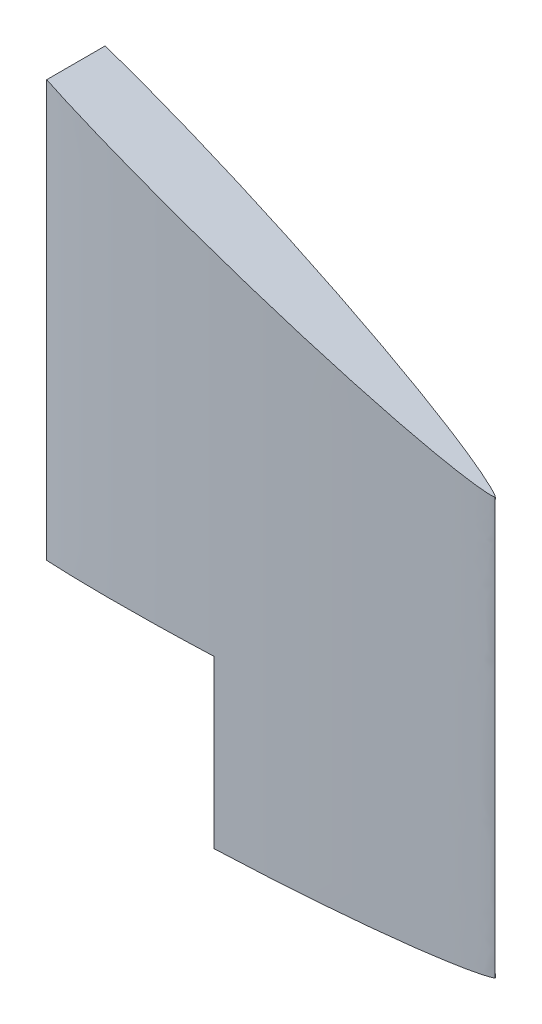
ISO-10303-21;
HEADER;
FILE_DESCRIPTION(('STEP AP214'),'2;1');
FILE_NAME('part.step','',(''),(''),'','','');
FILE_SCHEMA(('AUTOMOTIVE_DESIGN { 1 0 10303 214 1 1 1 1 }'));
ENDSEC;
DATA;
#1=APPLICATION_CONTEXT('core data for automotive mechanical design processes');
#2=APPLICATION_PROTOCOL_DEFINITION('international standard','automotive_design',2000,#1);
#3=PRODUCT_CONTEXT('',#1,'mechanical');
#4=PRODUCT('Part','Part','',(#3));
#5=PRODUCT_RELATED_PRODUCT_CATEGORY('part','',(#4));
#6=PRODUCT_DEFINITION_FORMATION('','',#4);
#7=PRODUCT_DEFINITION_CONTEXT('part definition',#1,'design');
#8=PRODUCT_DEFINITION('design','',#6,#7);
#9=PRODUCT_DEFINITION_SHAPE('','',#8);
#10=(LENGTH_UNIT() NAMED_UNIT(*) SI_UNIT(.MILLI.,.METRE.));
#11=(NAMED_UNIT(*) PLANE_ANGLE_UNIT() SI_UNIT($,.RADIAN.));
#12=(NAMED_UNIT(*) SI_UNIT($,.STERADIAN.) SOLID_ANGLE_UNIT());
#13=UNCERTAINTY_MEASURE_WITH_UNIT(LENGTH_MEASURE(1.E-05),#10,'distance_accuracy_value','');
#14=(GEOMETRIC_REPRESENTATION_CONTEXT(3) GLOBAL_UNCERTAINTY_ASSIGNED_CONTEXT((#13)) GLOBAL_UNIT_ASSIGNED_CONTEXT((#10,
#11,#12)) REPRESENTATION_CONTEXT('',''));
#15=CARTESIAN_POINT('',(0.,0.,0.));
#16=DIRECTION('',(0.,0.,1.));
#17=DIRECTION('',(1.,0.,0.));
#18=AXIS2_PLACEMENT_3D('',#15,#16,#17);
#19=CARTESIAN_POINT('',(4.,50.,0.));
#20=DIRECTION('',(-1.,0.,0.));
#21=DIRECTION('',(0.,0.,1.));
#22=AXIS2_PLACEMENT_3D('',#19,#20,#21);
#23=CYLINDRICAL_SURFACE('',#22,2.5);
#24=DIRECTION('',(-1.,0.,0.));
#25=VECTOR('',#24,1.);
#26=CARTESIAN_POINT('',(4.,50.,-2.5));
#27=LINE('',#26,#25);
#28=CARTESIAN_POINT('',(3.,50.,-2.5));
#29=VERTEX_POINT('',#28);
#30=CARTESIAN_POINT('',(0.,50.,-2.5));
#31=VERTEX_POINT('',#30);
#32=EDGE_CURVE('E327',#29,#31,#27,.T.);
#33=ORIENTED_EDGE('',*,*,#32,.F.);
#34=CARTESIAN_POINT('',(3.,50.,0.));
#35=DIRECTION('',(1.,0.,0.));
#36=DIRECTION('',(0.,0.,-1.));
#37=AXIS2_PLACEMENT_3D('',#34,#35,#36);
#38=CIRCLE('',#37,2.5);
#39=CARTESIAN_POINT('',(3.,50.,2.5));
#40=VERTEX_POINT('',#39);
#41=EDGE_CURVE('E11',#29,#40,#38,.T.);
#42=ORIENTED_EDGE('',*,*,#41,.T.);
#43=DIRECTION('',(-1.,0.,0.));
#44=VECTOR('',#43,1.);
#45=CARTESIAN_POINT('',(4.,50.,2.5));
#46=LINE('',#45,#44);
#47=CARTESIAN_POINT('',(0.,50.,2.5));
#48=VERTEX_POINT('',#47);
#49=EDGE_CURVE('E331',#48,#40,#46,.F.);
#50=ORIENTED_EDGE('',*,*,#49,.F.);
#51=CARTESIAN_POINT('',(0.,50.,0.));
#52=DIRECTION('',(1.,0.,0.));
#53=DIRECTION('',(0.,0.,-1.));
#54=AXIS2_PLACEMENT_3D('',#51,#52,#53);
#55=CIRCLE('',#54,2.5);
#56=EDGE_CURVE('E200',#31,#48,#55,.T.);
#57=ORIENTED_EDGE('',*,*,#56,.F.);
#58=EDGE_LOOP('',(#33,#42,#50,#57));
#59=FACE_BOUND('',#58,.T.);
#60=ADVANCED_FACE('F47',(#59),#23,.F.);
#61=CARTESIAN_POINT('',(20.,30.,100.));
#62=DIRECTION('',(0.,-1.,0.));
#63=DIRECTION('',(0.,0.,-1.));
#64=AXIS2_PLACEMENT_3D('',#61,#62,#63);
#65=PLANE('',#64);
#66=DIRECTION('',(0.,0.,-1.));
#67=VECTOR('',#66,1.);
#68=CARTESIAN_POINT('',(25.,30.,100.));
#69=LINE('',#68,#67);
#70=CARTESIAN_POINT('',(25.,30.,1.));
#71=VERTEX_POINT('',#70);
#72=CARTESIAN_POINT('',(25.,30.,-1.));
#73=VERTEX_POINT('',#72);
#74=EDGE_CURVE('E57',#71,#73,#69,.T.);
#75=ORIENTED_EDGE('',*,*,#74,.T.);
#76=DIRECTION('',(-1.,0.,0.));
#77=VECTOR('',#76,1.);
#78=CARTESIAN_POINT('',(20.,30.,-1.));
#79=LINE('',#78,#77);
#80=CARTESIAN_POINT('',(20.,30.,-1.));
#81=VERTEX_POINT('',#80);
#82=EDGE_CURVE('E197',#73,#81,#79,.T.);
#83=ORIENTED_EDGE('',*,*,#82,.T.);
#84=DIRECTION('',(0.,0.,-1.));
#85=VECTOR('',#84,1.);
#86=CARTESIAN_POINT('',(20.,30.,100.));
#87=LINE('',#86,#85);
#88=CARTESIAN_POINT('',(20.,30.,-3.43935953604389));
#89=VERTEX_POINT('',#88);
#90=EDGE_CURVE('E211',#81,#89,#87,.T.);
#91=ORIENTED_EDGE('',*,*,#90,.T.);
#92=CARTESIAN_POINT('',(50.3661592738637,30.,0.));
#93=CARTESIAN_POINT('',(50.3616118562395,30.,-0.00762680855709814));
#94=CARTESIAN_POINT('',(50.3512044792518,30.,-0.0200643696451995));
#95=CARTESIAN_POINT('',(50.3318826190291,30.,-0.0345900162266343));
#96=CARTESIAN_POINT('',(50.3035506437528,30.,-0.0542061046902817));
#97=CARTESIAN_POINT('',(50.2675502012029,30.,-0.0755566082807041));
#98=CARTESIAN_POINT('',(50.2125028650232,30.,-0.104975159955153));
#99=CARTESIAN_POINT('',(50.1196532979198,30.,-0.148566943095973));
#100=CARTESIAN_POINT('',(49.9578195191268,30.,-0.214752734128447));
#101=CARTESIAN_POINT('',(49.6652156749401,30.,-0.317523282541781));
#102=CARTESIAN_POINT('',(49.139251249857,30.,-0.473472151135026));
#103=CARTESIAN_POINT('',(48.2702240342564,30.,-0.688745907600272));
#104=CARTESIAN_POINT('',(46.7082308396749,30.,-1.01164002390838));
#105=CARTESIAN_POINT('',(44.5065746833417,30.,-1.38043235339458));
#106=CARTESIAN_POINT('',(41.7789466606536,30.,-1.75993168344461));
#107=CARTESIAN_POINT('',(38.6521261316823,30.,-2.12475953805125));
#108=CARTESIAN_POINT('',(35.5142655651926,30.,-2.43871046672291));
#109=CARTESIAN_POINT('',(32.3724356917928,30.,-2.71003640810005));
#110=CARTESIAN_POINT('',(29.2276790811344,30.,-2.9445648543411));
#111=CARTESIAN_POINT('',(26.0806013498758,30.,-3.14556526070059));
#112=CARTESIAN_POINT('',(22.931686571125,30.,-3.31520168505161));
#113=CARTESIAN_POINT('',(19.7812793383263,30.,-3.45435509452885));
#114=CARTESIAN_POINT('',(16.6296764172778,30.,-3.56326532612088));
#115=CARTESIAN_POINT('',(13.477153227085,30.,-3.64092262955651));
#116=CARTESIAN_POINT('',(10.3239677202417,30.,-3.6857079522972));
#117=CARTESIAN_POINT('',(7.170479651101,30.,-3.69356013589497));
#118=CARTESIAN_POINT('',(4.19455884170988,30.,-3.6608978186201));
#119=CARTESIAN_POINT('',(2.00769782103691,30.,-3.59990807983809));
#120=CARTESIAN_POINT('',(0.609689029807609,30.,-3.53853177419109));
#121=CARTESIAN_POINT('',(0.,30.,-3.5));
#122=B_SPLINE_CURVE_WITH_KNOTS('',4,(#92,#93,#94,#95,#96,#97,#98,#99,#100,#101,#102,#103,#104,
#105,#106,#107,#108,#109,#110,#111,#112,#113,#114,#115,#116,#117,#118,#119,#120,#121),
.UNSPECIFIED.,.F.,.F.,(5,1,1,1,1,1,1,1,1,1,1,1,1,1,1,1,1,1,1,1,1,1,1,1,1,1,5),(0.,
0.000698989607127983,0.00128797500242194,0.0018802402576548,0.00273339282005306,
0.00399607545305412,0.00621873732563578,0.00997421151381837,0.0165362239634812,
0.0284749684633255,0.0495243973178177,0.0806512334779741,0.142462146623907,0.204715828119719,
0.266969519588256,0.329223210986134,0.391476901103132,0.453730594074204,0.515984286439049,
0.578237976755758,0.640491668862722,0.702745360088075,0.76499905208171,0.82725274220259,
0.889506435243522,0.951760126967698,1.),.UNSPECIFIED.);
#123=CARTESIAN_POINT('',(50.3661592738637,30.,0.));
#124=VERTEX_POINT('',#123);
#125=EDGE_CURVE('E299',#89,#124,#122,.F.);
#126=ORIENTED_EDGE('',*,*,#125,.T.);
#127=CARTESIAN_POINT('',(0.,30.,3.5));
#128=CARTESIAN_POINT('',(0.609689029807609,30.,3.53853177419109));
#129=CARTESIAN_POINT('',(2.00769782103691,30.,3.59990807983809));
#130=CARTESIAN_POINT('',(4.19455884170988,30.,3.6608978186201));
#131=CARTESIAN_POINT('',(7.170479651101,30.,3.69356013589497));
#132=CARTESIAN_POINT('',(10.3239677202417,30.,3.6857079522972));
#133=CARTESIAN_POINT('',(13.477153227085,30.,3.64092262955651));
#134=CARTESIAN_POINT('',(16.6296764172778,30.,3.56326532612088));
#135=CARTESIAN_POINT('',(19.7812793383263,30.,3.45435509452885));
#136=CARTESIAN_POINT('',(22.931686571125,30.,3.31520168505161));
#137=CARTESIAN_POINT('',(26.0806013498758,30.,3.14556526070059));
#138=CARTESIAN_POINT('',(29.2276790811344,30.,2.9445648543411));
#139=CARTESIAN_POINT('',(32.3724356917928,30.,2.71003640810005));
#140=CARTESIAN_POINT('',(35.5142655651926,30.,2.43871046672291));
#141=CARTESIAN_POINT('',(38.6521261316823,30.,2.12475953805125));
#142=CARTESIAN_POINT('',(41.7789466606536,30.,1.75993168344461));
#143=CARTESIAN_POINT('',(44.5065746833417,30.,1.38043235339458));
#144=CARTESIAN_POINT('',(46.7082308396749,30.,1.01164002390838));
#145=CARTESIAN_POINT('',(48.2702240342564,30.,0.688745907600272));
#146=CARTESIAN_POINT('',(49.139251249857,30.,0.473472151135026));
#147=CARTESIAN_POINT('',(49.6652156749401,30.,0.317523282541781));
#148=CARTESIAN_POINT('',(49.9578195191268,30.,0.214752734128447));
#149=CARTESIAN_POINT('',(50.1196532979198,30.,0.148566943095973));
#150=CARTESIAN_POINT('',(50.2125028650232,30.,0.104975159955153));
#151=CARTESIAN_POINT('',(50.2675502012029,30.,0.0755566082807041));
#152=CARTESIAN_POINT('',(50.3035506437528,30.,0.0542061046902817));
#153=CARTESIAN_POINT('',(50.3318826190291,30.,0.0345900162266343));
#154=CARTESIAN_POINT('',(50.3512044792518,30.,0.0200643696451995));
#155=CARTESIAN_POINT('',(50.3616118562395,30.,0.00762680855709814));
#156=CARTESIAN_POINT('',(50.3661592738637,30.,0.));
#157=B_SPLINE_CURVE_WITH_KNOTS('',4,(#127,#128,#129,#130,#131,#132,#133,#134,#135,#136,#137,
#138,#139,#140,#141,#142,#143,#144,#145,#146,#147,#148,#149,#150,#151,#152,#153,#154,#155,#156),
.UNSPECIFIED.,.F.,.F.,(5,1,1,1,1,1,1,1,1,1,1,1,1,1,1,1,1,1,1,1,1,1,1,1,1,1,5),(0.,
0.0482398730323025,0.110493564756478,0.17274725779741,0.23500094791829,0.297254639911925,
0.359508331137278,0.421762023244242,0.484015713560951,0.546269405925796,0.608523098896868,
0.670776789013866,0.733030480411744,0.795284171880281,0.857537853376093,0.919348766522026,
0.950475602682182,0.971525031536674,0.983463776036519,0.990025788486182,0.993781262674364,
0.996003924546946,0.997266607179947,0.998119759742345,0.998712024997578,0.999301010392872,1.),.UNSPECIFIED.);
#158=CARTESIAN_POINT('',(20.,30.,3.43935953604389));
#159=VERTEX_POINT('',#158);
#160=EDGE_CURVE('E232',#124,#159,#157,.F.);
#161=ORIENTED_EDGE('',*,*,#160,.T.);
#162=CARTESIAN_POINT('',(20.,30.,1.));
#163=VERTEX_POINT('',#162);
#164=EDGE_CURVE('E212',#159,#163,#87,.T.);
#165=ORIENTED_EDGE('',*,*,#164,.T.);
#166=DIRECTION('',(1.,0.,0.));
#167=VECTOR('',#166,1.);
#168=CARTESIAN_POINT('',(20.,30.,1.));
#169=LINE('',#168,#167);
#170=EDGE_CURVE('E194',#163,#71,#169,.T.);
#171=ORIENTED_EDGE('',*,*,#170,.T.);
#172=EDGE_LOOP('',(#75,#83,#91,#126,#161,#165,#171));
#173=FACE_BOUND('',#172,.T.);
#174=ADVANCED_FACE('F262',(#173),#65,.T.);
#175=CARTESIAN_POINT('',(20.,50.,100.));
#176=DIRECTION('',(-1.,0.,0.));
#177=DIRECTION('',(0.,-1.,0.));
#178=AXIS2_PLACEMENT_3D('',#175,#176,#177);
#179=PLANE('',#178);
#180=ORIENTED_EDGE('',*,*,#90,.F.);
#181=DIRECTION('',(0.,-1.,0.));
#182=VECTOR('',#181,1.);
#183=CARTESIAN_POINT('',(20.,50.,-1.));
#184=LINE('',#183,#182);
#185=CARTESIAN_POINT('',(20.,50.,-1.));
#186=VERTEX_POINT('',#185);
#187=EDGE_CURVE('E192',#186,#81,#184,.T.);
#188=ORIENTED_EDGE('',*,*,#187,.F.);
#189=DIRECTION('',(0.,0.,-1.));
#190=VECTOR('',#189,1.);
#191=CARTESIAN_POINT('',(20.,50.,100.));
#192=LINE('',#191,#190);
#193=CARTESIAN_POINT('',(20.,50.,-3.43935953642786));
#194=VERTEX_POINT('',#193);
#195=EDGE_CURVE('E207',#186,#194,#192,.T.);
#196=ORIENTED_EDGE('',*,*,#195,.T.);
#197=DIRECTION('',(0.,-1.,0.));
#198=VECTOR('',#197,1.);
#199=CARTESIAN_POINT('',(20.,100.,-3.43935953604389));
#200=LINE('',#199,#198);
#201=EDGE_CURVE('E296',#194,#89,#200,.T.);
#202=ORIENTED_EDGE('',*,*,#201,.T.);
#203=EDGE_LOOP('',(#180,#188,#196,#202));
#204=FACE_BOUND('',#203,.T.);
#205=ADVANCED_FACE('F277',(#204),#179,.T.);
#206=CARTESIAN_POINT('',(20.,50.,3.43935953565876));
#207=VERTEX_POINT('',#206);
#208=CARTESIAN_POINT('',(20.,50.,1.));
#209=VERTEX_POINT('',#208);
#210=EDGE_CURVE('E208',#207,#209,#192,.T.);
#211=ORIENTED_EDGE('',*,*,#210,.T.);
#212=DIRECTION('',(0.,-1.,0.));
#213=VECTOR('',#212,1.);
#214=CARTESIAN_POINT('',(20.,50.,1.));
#215=LINE('',#214,#213);
#216=EDGE_CURVE('E189',#209,#163,#215,.T.);
#217=ORIENTED_EDGE('',*,*,#216,.T.);
#218=ORIENTED_EDGE('',*,*,#164,.F.);
#219=DIRECTION('',(0.,-1.,0.));
#220=VECTOR('',#219,1.);
#221=CARTESIAN_POINT('',(20.,100.,3.43935953604389));
#222=LINE('',#221,#220);
#223=EDGE_CURVE('E227',#159,#207,#222,.F.);
#224=ORIENTED_EDGE('',*,*,#223,.T.);
#225=EDGE_LOOP('',(#211,#217,#218,#224));
#226=FACE_BOUND('',#225,.T.);
#227=ADVANCED_FACE('F284',(#226),#179,.T.);
#228=CARTESIAN_POINT('',(0.,50.,100.));
#229=DIRECTION('',(0.,-1.,0.));
#230=DIRECTION('',(0.,0.,-1.));
#231=AXIS2_PLACEMENT_3D('',#228,#229,#230);
#232=PLANE('',#231);
#233=DIRECTION('',(0.,0.,-1.));
#234=VECTOR('',#233,1.);
#235=CARTESIAN_POINT('',(0.,50.,100.));
#236=LINE('',#235,#234);
#237=CARTESIAN_POINT('',(0.,50.,3.5));
#238=VERTEX_POINT('',#237);
#239=EDGE_CURVE('E204',#238,#48,#236,.T.);
#240=ORIENTED_EDGE('',*,*,#239,.T.);
#241=ORIENTED_EDGE('',*,*,#49,.T.);
#242=DIRECTION('',(-1.,0.,0.));
#243=VECTOR('',#242,1.);
#244=CARTESIAN_POINT('',(4.,50.,2.5));
#245=LINE('',#244,#243);
#246=CARTESIAN_POINT('',(4.,50.,2.5));
#247=VERTEX_POINT('',#246);
#248=EDGE_CURVE('E170',#247,#40,#245,.T.);
#249=ORIENTED_EDGE('',*,*,#248,.F.);
#250=DIRECTION('',(0.,0.,1.));
#251=VECTOR('',#250,1.);
#252=CARTESIAN_POINT('',(4.,50.,100.));
#253=LINE('',#252,#251);
#254=CARTESIAN_POINT('',(4.,50.,-2.5));
#255=VERTEX_POINT('',#254);
#256=EDGE_CURVE('E315',#255,#247,#253,.T.);
#257=ORIENTED_EDGE('',*,*,#256,.F.);
#258=EDGE_CURVE('E328',#255,#29,#27,.T.);
#259=ORIENTED_EDGE('',*,*,#258,.T.);
#260=ORIENTED_EDGE('',*,*,#32,.T.);
#261=CARTESIAN_POINT('',(0.,50.,-3.5));
#262=VERTEX_POINT('',#261);
#263=EDGE_CURVE('E203',#31,#262,#236,.T.);
#264=ORIENTED_EDGE('',*,*,#263,.T.);
#265=CARTESIAN_POINT('',(50.3661592738637,50.,0.));
#266=CARTESIAN_POINT('',(50.3616118562395,50.,-0.00762680855709814));
#267=CARTESIAN_POINT('',(50.3512044792518,50.,-0.0200643696451995));
#268=CARTESIAN_POINT('',(50.3318826190291,50.,-0.0345900162266343));
#269=CARTESIAN_POINT('',(50.3035506437528,50.,-0.0542061046902817));
#270=CARTESIAN_POINT('',(50.2675502012029,50.,-0.0755566082807041));
#271=CARTESIAN_POINT('',(50.2125028650232,50.,-0.104975159955153));
#272=CARTESIAN_POINT('',(50.1196532979198,50.,-0.148566943095973));
#273=CARTESIAN_POINT('',(49.9578195191268,50.,-0.214752734128447));
#274=CARTESIAN_POINT('',(49.6652156749401,50.,-0.317523282541781));
#275=CARTESIAN_POINT('',(49.139251249857,50.,-0.473472151135026));
#276=CARTESIAN_POINT('',(48.2702240342564,50.,-0.688745907600272));
#277=CARTESIAN_POINT('',(46.7082308396749,50.,-1.01164002390838));
#278=CARTESIAN_POINT('',(44.5065746833417,50.,-1.38043235339458));
#279=CARTESIAN_POINT('',(41.7789466606536,50.,-1.75993168344461));
#280=CARTESIAN_POINT('',(38.6521261316823,50.,-2.12475953805125));
#281=CARTESIAN_POINT('',(35.5142655651926,50.,-2.43871046672291));
#282=CARTESIAN_POINT('',(32.3724356917928,50.,-2.71003640810005));
#283=CARTESIAN_POINT('',(29.2276790811344,50.,-2.9445648543411));
#284=CARTESIAN_POINT('',(26.0806013498758,50.,-3.14556526070059));
#285=CARTESIAN_POINT('',(22.931686571125,50.,-3.31520168505161));
#286=CARTESIAN_POINT('',(19.7812793383263,50.,-3.45435509452885));
#287=CARTESIAN_POINT('',(16.6296764172778,50.,-3.56326532612088));
#288=CARTESIAN_POINT('',(13.477153227085,50.,-3.64092262955651));
#289=CARTESIAN_POINT('',(10.3239677202417,50.,-3.6857079522972));
#290=CARTESIAN_POINT('',(7.170479651101,50.,-3.69356013589497));
#291=CARTESIAN_POINT('',(4.19455884170988,50.,-3.6608978186201));
#292=CARTESIAN_POINT('',(2.00769782103691,50.,-3.59990807983809));
#293=CARTESIAN_POINT('',(0.609689029807609,50.,-3.53853177419109));
#294=CARTESIAN_POINT('',(0.,50.,-3.5));
#295=B_SPLINE_CURVE_WITH_KNOTS('',4,(#265,#266,#267,#268,#269,#270,#271,#272,#273,#274,#275,
#276,#277,#278,#279,#280,#281,#282,#283,#284,#285,#286,#287,#288,#289,#290,#291,#292,#293,#294),
.UNSPECIFIED.,.F.,.F.,(5,1,1,1,1,1,1,1,1,1,1,1,1,1,1,1,1,1,1,1,1,1,1,1,1,1,5),(0.,
0.000698989607127983,0.00128797500242194,0.0018802402576548,0.00273339282005306,
0.00399607545305412,0.00621873732563578,0.00997421151381837,0.0165362239634812,
0.0284749684633255,0.0495243973178177,0.0806512334779741,0.142462146623907,0.204715828119719,
0.266969519588256,0.329223210986134,0.391476901103132,0.453730594074204,0.515984286439049,
0.578237976755758,0.640491668862722,0.702745360088075,0.76499905208171,0.82725274220259,
0.889506435243522,0.951760126967698,1.),.UNSPECIFIED.);
#296=EDGE_CURVE('E215',#262,#194,#295,.F.);
#297=ORIENTED_EDGE('',*,*,#296,.T.);
#298=ORIENTED_EDGE('',*,*,#195,.F.);
#299=DIRECTION('',(-1.,0.,0.));
#300=VECTOR('',#299,1.);
#301=CARTESIAN_POINT('',(25.,50.,-1.));
#302=LINE('',#301,#300);
#303=CARTESIAN_POINT('',(25.,50.,-1.));
#304=VERTEX_POINT('',#303);
#305=EDGE_CURVE('E173',#304,#186,#302,.T.);
#306=ORIENTED_EDGE('',*,*,#305,.F.);
#307=DIRECTION('',(0.,0.,-1.));
#308=VECTOR('',#307,1.);
#309=CARTESIAN_POINT('',(25.,50.,1.));
#310=LINE('',#309,#308);
#311=CARTESIAN_POINT('',(25.,50.,1.));
#312=VERTEX_POINT('',#311);
#313=EDGE_CURVE('E181',#312,#304,#310,.T.);
#314=ORIENTED_EDGE('',*,*,#313,.F.);
#315=DIRECTION('',(1.,0.,0.));
#316=VECTOR('',#315,1.);
#317=CARTESIAN_POINT('',(20.,50.,1.));
#318=LINE('',#317,#316);
#319=EDGE_CURVE('E64',#209,#312,#318,.T.);
#320=ORIENTED_EDGE('',*,*,#319,.F.);
#321=ORIENTED_EDGE('',*,*,#210,.F.);
#322=CARTESIAN_POINT('',(0.,50.,3.5));
#323=CARTESIAN_POINT('',(0.609689029807609,50.,3.53853177419109));
#324=CARTESIAN_POINT('',(2.00769782103691,50.,3.59990807983809));
#325=CARTESIAN_POINT('',(4.19455884170988,50.,3.6608978186201));
#326=CARTESIAN_POINT('',(7.170479651101,50.,3.69356013589497));
#327=CARTESIAN_POINT('',(10.3239677202417,50.,3.6857079522972));
#328=CARTESIAN_POINT('',(13.477153227085,50.,3.64092262955651));
#329=CARTESIAN_POINT('',(16.6296764172778,50.,3.56326532612088));
#330=CARTESIAN_POINT('',(19.7812793383263,50.,3.45435509452885));
#331=CARTESIAN_POINT('',(22.931686571125,50.,3.31520168505161));
#332=CARTESIAN_POINT('',(26.0806013498758,50.,3.14556526070059));
#333=CARTESIAN_POINT('',(29.2276790811344,50.,2.9445648543411));
#334=CARTESIAN_POINT('',(32.3724356917928,50.,2.71003640810005));
#335=CARTESIAN_POINT('',(35.5142655651926,50.,2.43871046672291));
#336=CARTESIAN_POINT('',(38.6521261316823,50.,2.12475953805125));
#337=CARTESIAN_POINT('',(41.7789466606536,50.,1.75993168344461));
#338=CARTESIAN_POINT('',(44.5065746833417,50.,1.38043235339458));
#339=CARTESIAN_POINT('',(46.7082308396749,50.,1.01164002390838));
#340=CARTESIAN_POINT('',(48.2702240342564,50.,0.688745907600272));
#341=CARTESIAN_POINT('',(49.139251249857,50.,0.473472151135026));
#342=CARTESIAN_POINT('',(49.6652156749401,50.,0.317523282541781));
#343=CARTESIAN_POINT('',(49.9578195191268,50.,0.214752734128447));
#344=CARTESIAN_POINT('',(50.1196532979198,50.,0.148566943095973));
#345=CARTESIAN_POINT('',(50.2125028650232,50.,0.104975159955153));
#346=CARTESIAN_POINT('',(50.2675502012029,50.,0.0755566082807041));
#347=CARTESIAN_POINT('',(50.3035506437528,50.,0.0542061046902817));
#348=CARTESIAN_POINT('',(50.3318826190291,50.,0.0345900162266343));
#349=CARTESIAN_POINT('',(50.3512044792518,50.,0.0200643696451995));
#350=CARTESIAN_POINT('',(50.3616118562395,50.,0.00762680855709814));
#351=CARTESIAN_POINT('',(50.3661592738637,50.,0.));
#352=B_SPLINE_CURVE_WITH_KNOTS('',4,(#322,#323,#324,#325,#326,#327,#328,#329,#330,#331,#332,
#333,#334,#335,#336,#337,#338,#339,#340,#341,#342,#343,#344,#345,#346,#347,#348,#349,#350,#351),
.UNSPECIFIED.,.F.,.F.,(5,1,1,1,1,1,1,1,1,1,1,1,1,1,1,1,1,1,1,1,1,1,1,1,1,1,5),(0.,
0.0482398730323025,0.110493564756478,0.17274725779741,0.23500094791829,0.297254639911925,
0.359508331137278,0.421762023244242,0.484015713560951,0.546269405925796,0.608523098896868,
0.670776789013866,0.733030480411744,0.795284171880281,0.857537853376093,0.919348766522026,
0.950475602682182,0.971525031536674,0.983463776036519,0.990025788486182,0.993781262674364,
0.996003924546946,0.997266607179947,0.998119759742345,0.998712024997578,0.999301010392872,1.),.UNSPECIFIED.);
#353=EDGE_CURVE('E220',#207,#238,#352,.F.);
#354=ORIENTED_EDGE('',*,*,#353,.T.);
#355=EDGE_LOOP('',(#240,#241,#249,#257,#259,#260,#264,#297,#298,#306,#314,#320,#321,#354));
#356=FACE_BOUND('',#355,.T.);
#357=ADVANCED_FACE('F282',(#356),#232,.T.);
#358=CARTESIAN_POINT('',(0.,100.,3.5));
#359=CARTESIAN_POINT('',(0.609689029807609,100.,3.53853177419109));
#360=CARTESIAN_POINT('',(2.00769782103691,100.,3.59990807983809));
#361=CARTESIAN_POINT('',(4.19455884170988,100.,3.6608978186201));
#362=CARTESIAN_POINT('',(7.170479651101,100.,3.69356013589497));
#363=CARTESIAN_POINT('',(10.3239677202417,100.,3.6857079522972));
#364=CARTESIAN_POINT('',(13.477153227085,100.,3.64092262955651));
#365=CARTESIAN_POINT('',(16.6296764172778,100.,3.56326532612088));
#366=CARTESIAN_POINT('',(19.7812793383263,100.,3.45435509452885));
#367=CARTESIAN_POINT('',(22.931686571125,100.,3.31520168505161));
#368=CARTESIAN_POINT('',(26.0806013498758,100.,3.14556526070059));
#369=CARTESIAN_POINT('',(29.2276790811344,100.,2.9445648543411));
#370=CARTESIAN_POINT('',(32.3724356917928,100.,2.71003640810005));
#371=CARTESIAN_POINT('',(35.5142655651926,100.,2.43871046672291));
#372=CARTESIAN_POINT('',(38.6521261316823,100.,2.12475953805125));
#373=CARTESIAN_POINT('',(41.7789466606536,100.,1.75993168344461));
#374=CARTESIAN_POINT('',(44.5065746833417,100.,1.38043235339458));
#375=CARTESIAN_POINT('',(46.7082308396749,100.,1.01164002390838));
#376=CARTESIAN_POINT('',(48.2702240342564,100.,0.688745907600272));
#377=CARTESIAN_POINT('',(49.139251249857,100.,0.473472151135026));
#378=CARTESIAN_POINT('',(49.6652156749401,100.,0.317523282541781));
#379=CARTESIAN_POINT('',(49.9578195191268,100.,0.214752734128447));
#380=CARTESIAN_POINT('',(50.1196532979198,100.,0.148566943095973));
#381=CARTESIAN_POINT('',(50.2125028650232,100.,0.104975159955153));
#382=CARTESIAN_POINT('',(50.2675502012029,100.,0.0755566082807041));
#383=CARTESIAN_POINT('',(50.3035506437528,100.,0.0542061046902817));
#384=CARTESIAN_POINT('',(50.3318826190291,100.,0.0345900162266343));
#385=CARTESIAN_POINT('',(50.3512044792518,100.,0.0200643696451995));
#386=CARTESIAN_POINT('',(50.3616118562395,100.,0.00762680855709814));
#387=CARTESIAN_POINT('',(50.3661592738637,100.,0.));
#388=B_SPLINE_CURVE_WITH_KNOTS('',4,(#358,#359,#360,#361,#362,#363,#364,#365,#366,#367,#368,
#369,#370,#371,#372,#373,#374,#375,#376,#377,#378,#379,#380,#381,#382,#383,#384,#385,#386,#387),
.UNSPECIFIED.,.F.,.F.,(5,1,1,1,1,1,1,1,1,1,1,1,1,1,1,1,1,1,1,1,1,1,1,1,1,1,5),(0.,
0.0482398730323025,0.110493564756478,0.17274725779741,0.23500094791829,0.297254639911925,
0.359508331137278,0.421762023244242,0.484015713560951,0.546269405925796,0.608523098896868,
0.670776789013866,0.733030480411744,0.795284171880281,0.857537853376093,0.919348766522026,
0.950475602682182,0.971525031536674,0.983463776036519,0.990025788486182,0.993781262674364,
0.996003924546946,0.997266607179947,0.998119759742345,0.998712024997578,0.999301010392872,1.),.UNSPECIFIED.);
#389=DIRECTION('',(0.,-1.,0.));
#390=VECTOR('',#389,1.);
#391=SURFACE_OF_LINEAR_EXTRUSION('',#388,#390);
#392=ORIENTED_EDGE('',*,*,#160,.F.);
#393=DIRECTION('',(0.,-1.,0.));
#394=VECTOR('',#393,1.);
#395=CARTESIAN_POINT('',(50.3661592738637,100.,0.));
#396=LINE('',#395,#394);
#397=CARTESIAN_POINT('',(50.3661592738637,80.,0.));
#398=VERTEX_POINT('',#397);
#399=EDGE_CURVE('E313',#398,#124,#396,.T.);
#400=ORIENTED_EDGE('',*,*,#399,.F.);
#401=CARTESIAN_POINT('',(0.,100.,3.5));
#402=CARTESIAN_POINT('',(0.205093216168759,99.9185591202007,3.512921281286));
#403=CARTESIAN_POINT('',(0.410256296043909,99.837090498081,3.52442700329194));
#404=CARTESIAN_POINT('',(0.82067110230139,99.6741180530209,3.54527976465383));
#405=CARTESIAN_POINT('',(1.02592282537047,99.5926142313961,3.55462687869624));
#406=CARTESIAN_POINT('',(1.43646712181395,99.4295903668163,3.57183520364274));
#407=CARTESIAN_POINT('',(1.64175969243574,99.3480703249542,3.57969649353377));
#408=CARTESIAN_POINT('',(2.0523804257397,99.1850161079069,3.59432770243707));
#409=CARTESIAN_POINT('',(2.25770858877354,99.103481932582,3.60109760996879));
#410=CARTESIAN_POINT('',(2.66832569786943,98.9404291546788,3.61371695840991));
#411=CARTESIAN_POINT('',(2.87361463645181,98.8589105550707,3.61956668302164));
#412=CARTESIAN_POINT('',(3.28421105568888,98.6958659929453,3.63040872101608));
#413=CARTESIAN_POINT('',(3.48951853625896,98.6143400304618,3.63540103813084));
#414=CARTESIAN_POINT('',(4.10547121878127,98.369750134626,3.64919713542344));
#415=CARTESIAN_POINT('',(4.51613954004303,98.2066770207803,3.65681984739062));
#416=CARTESIAN_POINT('',(5.33748337822064,97.8805279357521,3.66934644910005));
#417=CARTESIAN_POINT('',(5.74815889282199,97.7174519654887,3.67425052048434));
#418=CARTESIAN_POINT('',(6.56952560670938,97.3912937966987,3.6816489455758));
#419=CARTESIAN_POINT('',(6.98021680587294,97.2282115982208,3.68414331530927));
#420=CARTESIAN_POINT('',(7.80160499488975,96.9020449018283,3.68695249782434));
#421=CARTESIAN_POINT('',(8.21230198473719,96.738960403916,3.68726731265302));
#422=CARTESIAN_POINT('',(9.03369337683555,96.4127924356053,3.68586879722536));
#423=CARTESIAN_POINT('',(9.44438777907999,96.2497089652095,3.6841554630764));
#424=CARTESIAN_POINT('',(10.6764627354822,95.7604618301628,3.67612938113591));
#425=CARTESIAN_POINT('',(11.4978281506434,95.4343041770867,3.66693053418128));
#426=CARTESIAN_POINT('',(13.1405019525685,94.7820115164559,3.64155797183259));
#427=CARTESIAN_POINT('',(13.961810334799,94.4558765107014,3.62538392663599));
#428=CARTESIAN_POINT('',(15.604314779189,93.8036511005966,3.5864941516308));
#429=CARTESIAN_POINT('',(16.4255108377978,93.4775606976562,3.56377824859036));
#430=CARTESIAN_POINT('',(18.0677277509319,92.825449463919,3.51202203533767));
#431=CARTESIAN_POINT('',(18.8887486059769,92.4994286329159,3.48298174415531));
#432=CARTESIAN_POINT('',(20.563681149414,91.8343262834079,3.41742704779437));
#433=CARTESIAN_POINT('',(21.4175842503944,91.4952481748957,3.38065849563346));
#434=CARTESIAN_POINT('',(23.1250959374684,90.817208907383,3.30041599471957));
#435=CARTESIAN_POINT('',(23.9787045306986,90.4782477455486,3.25694222185024));
#436=CARTESIAN_POINT('',(25.6855997137023,89.8004532868834,3.16316670088216));
#437=CARTESIAN_POINT('',(26.5388863028701,89.4616199902931,3.11286494000594));
#438=CARTESIAN_POINT('',(28.2450474676537,88.7841170044067,3.00516035171182));
#439=CARTESIAN_POINT('',(29.097922054912,88.4454473104875,2.94775773835758));
#440=CARTESIAN_POINT('',(30.8032054582857,87.7682928766537,2.82539810211586));
#441=CARTESIAN_POINT('',(31.655614273571,87.4298081370688,2.76044106580922));
#442=CARTESIAN_POINT('',(33.3598478768825,86.7530705704639,2.62232796770663));
#443=CARTESIAN_POINT('',(34.2116726741882,86.4148177397591,2.54917203937108));
#444=CARTESIAN_POINT('',(35.5984544352857,85.8641377668999,2.42249346433203));
#445=CARTESIAN_POINT('',(36.1336325405809,85.651622811219,2.37176610607981));
#446=CARTESIAN_POINT('',(37.2036488701787,85.2267278638875,2.26631060368324));
#447=CARTESIAN_POINT('',(37.7384870948417,85.0143478720939,2.21158246378773));
#448=CARTESIAN_POINT('',(38.8077357076633,84.589757778969,2.09768196971345));
#449=CARTESIAN_POINT('',(39.3421461107718,84.3775476717013,2.03850977834985));
#450=CARTESIAN_POINT('',(40.4104584989723,83.9533293459038,1.91507634047423));
#451=CARTESIAN_POINT('',(40.9443604876715,83.7413211259416,1.85081513034349));
#452=CARTESIAN_POINT('',(41.7976363948263,83.4024920710934,1.74325270554548));
#453=CARTESIAN_POINT('',(42.1172200273819,83.2755879604115,1.70187465695892));
#454=CARTESIAN_POINT('',(42.7561095711037,83.0218900199957,1.61669082096711));
#455=CARTESIAN_POINT('',(43.0754154814339,82.8950961905937,1.57288502627985));
#456=CARTESIAN_POINT('',(43.7136967369214,82.6416397965824,1.48254280872607));
#457=CARTESIAN_POINT('',(44.0326720793101,82.5149772330725,1.43600636317518));
#458=CARTESIAN_POINT('',(44.6702053972154,82.2618178391078,1.3397389821815));
#459=CARTESIAN_POINT('',(44.9887633770603,82.1353210069341,1.29000808014013));
#460=CARTESIAN_POINT('',(45.4948386524045,81.934362552829,1.20781075998203));
#461=CARTESIAN_POINT('',(45.6825357545161,81.8598295311265,1.17662517631002));
#462=CARTESIAN_POINT('',(46.0577012090648,81.7108543223921,1.11268976007832));
#463=CARTESIAN_POINT('',(46.2451695604539,81.6364121357764,1.07993992037943));
#464=CARTESIAN_POINT('',(46.6198202586062,81.4876413327,1.01266688414331));
#465=CARTESIAN_POINT('',(46.8070026218462,81.4133127096965,0.978143794066358));
#466=CARTESIAN_POINT('',(47.1810221021436,81.2647925581941,0.907002781146349));
#467=CARTESIAN_POINT('',(47.3678592239399,81.1906010278134,0.870384887279582));
#468=CARTESIAN_POINT('',(47.7712754805159,81.0304076509937,0.788401179116601));
#469=CARTESIAN_POINT('',(47.9877747520806,80.9444375176002,0.742578667487852));
#470=CARTESIAN_POINT('',(48.4199188240581,80.7728365544901,0.646292606934477));
#471=CARTESIAN_POINT('',(48.6355635446048,80.6872057564878,0.595828634415441));
#472=CARTESIAN_POINT('',(48.973127863375,80.5531616587694,0.511001868266079));
#473=CARTESIAN_POINT('',(49.0955634444291,80.5045434663881,0.479020486461902));
#474=CARTESIAN_POINT('',(49.3396704247514,80.4076105321158,0.411987886206343));
#475=CARTESIAN_POINT('',(49.4613421086702,80.3592956771922,0.376937894154306));
#476=CARTESIAN_POINT('',(49.6499327798828,80.284407826329,0.318553290826598));
#477=CARTESIAN_POINT('',(49.7172953519925,80.2576586863982,0.296883185255416));
#478=CARTESIAN_POINT('',(49.8514761583965,80.20437655874,0.251419586549861));
#479=CARTESIAN_POINT('',(49.9182938634511,80.1778437811696,0.227624247730144));
#480=CARTESIAN_POINT('',(50.0205609378695,80.1372343418584,0.188346264859765));
#481=CARTESIAN_POINT('',(50.0563942766031,80.1230052089445,0.174032790933253));
#482=CARTESIAN_POINT('',(50.1097113197664,80.1018334364957,0.151507327957554));
#483=CARTESIAN_POINT('',(50.1273905570233,80.0948131524352,0.143832801273246));
#484=CARTESIAN_POINT('',(50.1625721106785,80.0808428381756,0.128036053126703));
#485=CARTESIAN_POINT('',(50.1800744609911,80.0738927945094,0.119913919487168));
#486=CARTESIAN_POINT('',(50.2155337465613,80.0598121951223,0.102711369570826));
#487=CARTESIAN_POINT('',(50.2334801370041,80.0526858266632,0.0936053889395679));
#488=CARTESIAN_POINT('',(50.2601394794378,80.042099614485,0.0792375846422265));
#489=CARTESIAN_POINT('',(50.2690098485219,80.0385772616942,0.0743136764659642));
#490=CARTESIAN_POINT('',(50.2865878209073,80.0315971891062,0.0641513728881796));
#491=CARTESIAN_POINT('',(50.2952955409933,80.0281394229348,0.0589132154753164));
#492=CARTESIAN_POINT('',(50.3123188860391,80.0213795884383,0.0480094093945543));
#493=CARTESIAN_POINT('',(50.3206382328357,80.0180760422014,0.0423505431747894));
#494=CARTESIAN_POINT('',(50.3328627971151,80.0132217652601,0.0335494289285849));
#495=CARTESIAN_POINT('',(50.3368757993633,80.0116282340852,0.0305792077724974));
#496=CARTESIAN_POINT('',(50.3446999144561,80.0085213404067,0.0243499973237929));
#497=CARTESIAN_POINT('',(50.3485114489023,80.0070078104885,0.02109165256827));
#498=CARTESIAN_POINT('',(50.3547520316866,80.0045297248555,0.0149713774572434));
#499=CARTESIAN_POINT('',(50.357280807885,80.0035255680031,0.0122310442507849));
#500=CARTESIAN_POINT('',(50.3620089527807,80.0016480593887,0.00639207014103949));
#501=CARTESIAN_POINT('',(50.3642046298904,80.0007761735267,0.00329000535699504));
#502=CARTESIAN_POINT('',(50.3661592738592,80.0000000000018,7.56345584443986E-12));
#503=B_SPLINE_CURVE_WITH_KNOTS('',3,(#401,#402,#403,#404,#405,#406,#407,#408,#409,#410,#411,
#412,#413,#414,#415,#416,#417,#418,#419,#420,#421,#422,#423,#424,#425,#426,#427,#428,#429,#430,
#431,#432,#433,#434,#435,#436,#437,#438,#439,#440,#441,#442,#443,#444,#445,#446,#447,#448,#449,
#450,#451,#452,#453,#454,#455,#456,#457,#458,#459,#460,#461,#462,#463,#464,#465,#466,#467,#468,
#469,#470,#471,#472,#473,#474,#475,#476,#477,#478,#479,#480,#481,#482,#483,#484,#485,#486,#487,
#488,#489,#490,#491,#492,#493,#494,#495,#496,#497,#498,#499,#500,#501,#502),.UNSPECIFIED.,.F.,
.F.,(4,2,2,2,2,2,2,2,2,2,2,2,2,2,2,2,2,2,2,2,2,2,2,2,2,2,2,2,2,2,2,2,2,2,2,2,2,2,2,2,2,2,2,2,2,
2,2,2,2,2,4),(0.,0.663132464746791,1.32624198209232,1.98931623838137,2.65239746928008,
3.31527386270002,3.97814737073297,5.30391738248794,6.62959880415739,7.95527140899971,
9.28094276874384,10.6066166728474,13.2579867160485,15.9094821355343,18.5610477744755,
21.2126054350504,23.9710747152871,26.7294716508307,29.4878737483368,32.2461927107853,
35.0045165729954,37.7627955421183,39.4969589479752,41.2311205121763,42.9652185734695,
44.6993042388568,45.7383132978219,46.7773254734601,47.8163462817194,48.8553562276845,
49.4683938261611,50.0814342227792,50.6944378573348,51.3074330145921,52.0196280877983,
52.731888222797,53.1385526852121,53.5450553558195,53.7719852104269,53.9991140979212,
54.1224714781214,54.1840027179312,54.2455219276942,54.3095483873409,54.3417635071288,
54.3739545302805,54.4057077714743,54.4214279420129,54.4371137953308,54.4486685869666,
54.4603433135989),.UNSPECIFIED.);
#504=CARTESIAN_POINT('',(0.,100.,3.5));
#505=VERTEX_POINT('',#504);
#506=EDGE_CURVE('E246',#505,#398,#503,.T.);
#507=ORIENTED_EDGE('',*,*,#506,.F.);
#508=DIRECTION('',(0.,-1.,0.));
#509=VECTOR('',#508,1.);
#510=CARTESIAN_POINT('',(0.,100.,3.5));
#511=LINE('',#510,#509);
#512=EDGE_CURVE('E342',#505,#238,#511,.T.);
#513=ORIENTED_EDGE('',*,*,#512,.T.);
#514=ORIENTED_EDGE('',*,*,#353,.F.);
#515=ORIENTED_EDGE('',*,*,#223,.F.);
#516=EDGE_LOOP('',(#392,#400,#507,#513,#514,#515));
#517=FACE_BOUND('',#516,.T.);
#518=ADVANCED_FACE('F49',(#517),#391,.F.);
#519=CARTESIAN_POINT('',(50.3661592738637,100.,0.));
#520=CARTESIAN_POINT('',(50.3616118562395,100.,-0.00762680855709814));
#521=CARTESIAN_POINT('',(50.3512044792518,100.,-0.0200643696451995));
#522=CARTESIAN_POINT('',(50.3318826190291,100.,-0.0345900162266343));
#523=CARTESIAN_POINT('',(50.3035506437528,100.,-0.0542061046902817));
#524=CARTESIAN_POINT('',(50.2675502012029,100.,-0.0755566082807041));
#525=CARTESIAN_POINT('',(50.2125028650232,100.,-0.104975159955153));
#526=CARTESIAN_POINT('',(50.1196532979198,100.,-0.148566943095973));
#527=CARTESIAN_POINT('',(49.9578195191268,100.,-0.214752734128447));
#528=CARTESIAN_POINT('',(49.6652156749401,100.,-0.317523282541781));
#529=CARTESIAN_POINT('',(49.139251249857,100.,-0.473472151135026));
#530=CARTESIAN_POINT('',(48.2702240342564,100.,-0.688745907600272));
#531=CARTESIAN_POINT('',(46.7082308396749,100.,-1.01164002390838));
#532=CARTESIAN_POINT('',(44.5065746833417,100.,-1.38043235339458));
#533=CARTESIAN_POINT('',(41.7789466606536,100.,-1.75993168344461));
#534=CARTESIAN_POINT('',(38.6521261316823,100.,-2.12475953805125));
#535=CARTESIAN_POINT('',(35.5142655651926,100.,-2.43871046672291));
#536=CARTESIAN_POINT('',(32.3724356917928,100.,-2.71003640810005));
#537=CARTESIAN_POINT('',(29.2276790811344,100.,-2.9445648543411));
#538=CARTESIAN_POINT('',(26.0806013498758,100.,-3.14556526070059));
#539=CARTESIAN_POINT('',(22.931686571125,100.,-3.31520168505161));
#540=CARTESIAN_POINT('',(19.7812793383263,100.,-3.45435509452885));
#541=CARTESIAN_POINT('',(16.6296764172778,100.,-3.56326532612088));
#542=CARTESIAN_POINT('',(13.477153227085,100.,-3.64092262955651));
#543=CARTESIAN_POINT('',(10.3239677202417,100.,-3.6857079522972));
#544=CARTESIAN_POINT('',(7.170479651101,100.,-3.69356013589497));
#545=CARTESIAN_POINT('',(4.19455884170988,100.,-3.6608978186201));
#546=CARTESIAN_POINT('',(2.00769782103691,100.,-3.59990807983809));
#547=CARTESIAN_POINT('',(0.609689029807609,100.,-3.53853177419109));
#548=CARTESIAN_POINT('',(0.,100.,-3.5));
#549=B_SPLINE_CURVE_WITH_KNOTS('',4,(#519,#520,#521,#522,#523,#524,#525,#526,#527,#528,#529,
#530,#531,#532,#533,#534,#535,#536,#537,#538,#539,#540,#541,#542,#543,#544,#545,#546,#547,#548),
.UNSPECIFIED.,.F.,.F.,(5,1,1,1,1,1,1,1,1,1,1,1,1,1,1,1,1,1,1,1,1,1,1,1,1,1,5),(0.,
0.000698989607127983,0.00128797500242194,0.0018802402576548,0.00273339282005306,
0.00399607545305412,0.00621873732563578,0.00997421151381837,0.0165362239634812,
0.0284749684633255,0.0495243973178177,0.0806512334779741,0.142462146623907,0.204715828119719,
0.266969519588256,0.329223210986134,0.391476901103132,0.453730594074204,0.515984286439049,
0.578237976755758,0.640491668862722,0.702745360088075,0.76499905208171,0.82725274220259,
0.889506435243522,0.951760126967698,1.),.UNSPECIFIED.);
#550=DIRECTION('',(0.,-1.,0.));
#551=VECTOR('',#550,1.);
#552=SURFACE_OF_LINEAR_EXTRUSION('',#549,#551);
#553=ORIENTED_EDGE('',*,*,#125,.F.);
#554=ORIENTED_EDGE('',*,*,#201,.F.);
#555=ORIENTED_EDGE('',*,*,#296,.F.);
#556=DIRECTION('',(0.,-1.,0.));
#557=VECTOR('',#556,1.);
#558=CARTESIAN_POINT('',(0.,100.,-3.5));
#559=LINE('',#558,#557);
#560=CARTESIAN_POINT('',(0.,100.,-3.5));
#561=VERTEX_POINT('',#560);
#562=EDGE_CURVE('E317',#561,#262,#559,.T.);
#563=ORIENTED_EDGE('',*,*,#562,.F.);
#564=CARTESIAN_POINT('',(50.3661592738637,80.,0.));
#565=CARTESIAN_POINT('',(50.3643518663142,80.0007177071175,-0.00304118978941942));
#566=CARTESIAN_POINT('',(50.3623376036711,80.0015175547422,-0.00592379131122234));
#567=CARTESIAN_POINT('',(50.3580128568811,80.0032348771874,-0.0113743998613408));
#568=CARTESIAN_POINT('',(50.3557053791477,80.0041511581851,-0.0139451435513115));
#569=CARTESIAN_POINT('',(50.3508926910874,80.0060622382157,-0.0188121174942328));
#570=CARTESIAN_POINT('',(50.3483891927918,80.0070563574147,-0.0211103618868417));
#571=CARTESIAN_POINT('',(50.3432393999633,80.0091012990591,-0.0255282303323962));
#572=CARTESIAN_POINT('',(50.3405926905266,80.0101522862595,-0.0276472841869137));
#573=CARTESIAN_POINT('',(50.3326949372499,80.0132884210732,-0.0337385832128982));
#574=CARTESIAN_POINT('',(50.3273497480977,80.0154109530389,-0.0375666998174406));
#575=CARTESIAN_POINT('',(50.3165638796078,80.019693935361,-0.045064382915169));
#576=CARTESIAN_POINT('',(50.3111231724864,80.02185439675,-0.0487339021650532));
#577=CARTESIAN_POINT('',(50.3001185411347,80.0262242480591,-0.0558534935641358));
#578=CARTESIAN_POINT('',(50.2945546202401,80.0284336366544,-0.0593035716442981));
#579=CARTESIAN_POINT('',(50.2833421295407,80.032886027252,-0.0660364638579228));
#580=CARTESIAN_POINT('',(50.2776935710974,80.0351290247427,-0.0693193001854557));
#581=CARTESIAN_POINT('',(50.260466853046,80.0419696170371,-0.0791054031048423));
#582=CARTESIAN_POINT('',(50.2487994977717,80.0466026307283,-0.0854269797658177));
#583=CARTESIAN_POINT('',(50.2253067969089,80.0559313948038,-0.0977033860162023));
#584=CARTESIAN_POINT('',(50.2134815168275,80.0606271191758,-0.103658362252645));
#585=CARTESIAN_POINT('',(50.1780095760441,80.0747127438472,-0.120991684301462));
#586=CARTESIAN_POINT('',(50.1541816992448,80.0841746036129,-0.131940066274104));
#587=CARTESIAN_POINT('',(50.106233886304,80.1032142975788,-0.153073759485187));
#588=CARTESIAN_POINT('',(50.0821138817737,80.1127921589358,-0.163258887867137));
#589=CARTESIAN_POINT('',(50.0094150944661,80.1416602673465,-0.192966061975444));
#590=CARTESIAN_POINT('',(49.9605317501288,80.1610714533659,-0.211624025955286));
#591=CARTESIAN_POINT('',(49.8627945600695,80.1998821117398,-0.247265272039326));
#592=CARTESIAN_POINT('',(49.8139453059503,80.2192797608056,-0.264263432769472));
#593=CARTESIAN_POINT('',(49.7159519091752,80.2581921568223,-0.297147774524992));
#594=CARTESIAN_POINT('',(49.6668079233555,80.2777068414947,-0.31303449829487));
#595=CARTESIAN_POINT('',(49.4862200187684,80.3494168575812,-0.369738975178238));
#596=CARTESIAN_POINT('',(49.3540830558291,80.4018873913063,-0.407991569490392));
#597=CARTESIAN_POINT('',(49.0888992627216,80.5071897597739,-0.480887745276294));
#598=CARTESIAN_POINT('',(48.9558519830646,80.5600217730046,-0.515529382458609));
#599=CARTESIAN_POINT('',(48.6891503800986,80.6659268516571,-0.582133138747665));
#600=CARTESIAN_POINT('',(48.5554959323641,80.7189999664871,-0.614094679856427));
#601=CARTESIAN_POINT('',(48.2870669880966,80.8255909585888,-0.676122883014138));
#602=CARTESIAN_POINT('',(48.1522903159496,80.8791096997793,-0.706178557470114));
#603=CARTESIAN_POINT('',(47.8824648624506,80.9862552345547,-0.764616574083274));
#604=CARTESIAN_POINT('',(47.7474161696412,81.03988199298,-0.792999390908146));
#605=CARTESIAN_POINT('',(47.4770845276541,81.1472285311653,-0.848350327474531));
#606=CARTESIAN_POINT('',(47.3418016052353,81.2009483002996,-0.875318599051403));
#607=CARTESIAN_POINT('',(47.0038732960289,81.3351369357161,-0.941148438415301));
#608=CARTESIAN_POINT('',(46.8011039549383,81.415655023263,-0.979273106591582));
#609=CARTESIAN_POINT('',(46.3952219465608,81.57682753045,-1.05334992655009));
#610=CARTESIAN_POINT('',(46.192109274653,81.6574819519251,-1.08930204884883));
#611=CARTESIAN_POINT('',(45.5823323102182,81.8996195193815,-1.19434207051614));
#612=CARTESIAN_POINT('',(45.1752479003602,82.0612694906031,-1.26061002251793));
#613=CARTESIAN_POINT('',(44.3602009479517,82.3849181325322,-1.38749757098717));
#614=CARTESIAN_POINT('',(43.9522381734889,82.5469168953302,-1.44811542088483));
#615=CARTESIAN_POINT('',(43.1357635857945,82.8711324398409,-1.56480014419009));
#616=CARTESIAN_POINT('',(42.7272517874651,83.033349215636,-1.62086713868338));
#617=CARTESIAN_POINT('',(41.9106985714314,83.3575959828329,-1.72897056020817));
#618=CARTESIAN_POINT('',(41.502658150367,83.5196255784769,-1.78101573590013));
#619=CARTESIAN_POINT('',(40.6862173457165,83.8438277080105,-1.88173738402481));
#620=CARTESIAN_POINT('',(40.2778169600525,84.006000242725,-1.93041383688135));
#621=CARTESIAN_POINT('',(39.0523018663846,84.492642508618,-2.07197417229671));
#622=CARTESIAN_POINT('',(38.2347420800595,84.8172889768466,-2.16040611086521));
#623=CARTESIAN_POINT('',(36.3833828457572,85.5524489576725,-2.34953129205079));
#624=CARTESIAN_POINT('',(35.349329179605,85.9630634182787,-2.44732177530051));
#625=CARTESIAN_POINT('',(33.2801481413488,86.784718699558,-2.62981463867948));
#626=CARTESIAN_POINT('',(32.2450206889037,87.1957595521339,-2.71451595578563));
#627=CARTESIAN_POINT('',(30.173989250156,88.0181496126849,-2.87237439002833));
#628=CARTESIAN_POINT('',(29.1380852492425,88.4294988264619,-2.94553128418515));
#629=CARTESIAN_POINT('',(27.0649084003019,89.2527408122833,-3.08125957249315));
#630=CARTESIAN_POINT('',(26.0276351070184,89.6646337611354,-3.14382306580277));
#631=CARTESIAN_POINT('',(23.9526350185038,90.4885997408449,-3.25884805343457));
#632=CARTESIAN_POINT('',(22.9149082366844,90.9006727663765,-3.31130982859525));
#633=CARTESIAN_POINT('',(20.8390429170773,91.7249823224495,-3.4063510455103));
#634=CARTESIAN_POINT('',(19.800904371637,92.1372188560297,-3.44893029406464));
#635=CARTESIAN_POINT('',(17.9807472267703,92.8599887360874,-3.5148630147765));
#636=CARTESIAN_POINT('',(17.1987953830851,93.1704955743926,-3.54036758851145));
#637=CARTESIAN_POINT('',(15.6347437654911,93.7915679929145,-3.58557795245489));
#638=CARTESIAN_POINT('',(14.8526439911668,94.1021335732962,-3.60528372612769));
#639=CARTESIAN_POINT('',(13.2883534532733,94.7233008651629,-3.63867837524475));
#640=CARTESIAN_POINT('',(12.5061626925764,95.0339025755072,-3.65236740610008));
#641=CARTESIAN_POINT('',(10.9417395365697,95.6551225289685,-3.67327636005637));
#642=CARTESIAN_POINT('',(10.1595071447836,95.9657407706862,-3.68049657803806));
#643=CARTESIAN_POINT('',(8.98647370118224,96.4315429920639,-3.68598423979263));
#644=CARTESIAN_POINT('',(8.59568242919434,96.5867230882324,-3.68692375614658));
#645=CARTESIAN_POINT('',(7.81410025113814,96.8970831352657,-3.68692769941685));
#646=CARTESIAN_POINT('',(7.42330934507056,97.0522630861302,-3.68599212990458));
#647=CARTESIAN_POINT('',(6.64173572008715,97.3626197368066,-3.68209287913131));
#648=CARTESIAN_POINT('',(6.25095300117793,97.5177964366158,-3.67912919629015));
#649=CARTESIAN_POINT('',(5.46940500180921,97.8281429115651,-3.67095966480772));
#650=CARTESIAN_POINT('',(5.07863972147748,97.9833126866543,-3.66575380180083));
#651=CARTESIAN_POINT('',(4.29711902771092,98.2936483187668,-3.65281357393692));
#652=CARTESIAN_POINT('',(3.90636361654351,98.4488141748896,-3.64507904578973));
#653=CARTESIAN_POINT('',(3.32027873997297,98.681543803283,-3.63128818299298));
#654=CARTESIAN_POINT('',(3.12492677660813,98.7591165093147,-3.62632643392639));
#655=CARTESIAN_POINT('',(2.73424068491119,98.9142548392289,-3.61561177946896));
#656=CARTESIAN_POINT('',(2.53890655665579,98.9918204630809,-3.60985887082275));
#657=CARTESIAN_POINT('',(2.14820327507776,99.1469656189598,-3.59750417513528));
#658=CARTESIAN_POINT('',(1.95283412857714,99.2245451482776,-3.59090213654486));
#659=CARTESIAN_POINT('',(1.56213003732851,99.3796906256701,-3.57666751073642));
#660=CARTESIAN_POINT('',(1.36679509225731,99.4572565738732,-3.56903493384849));
#661=CARTESIAN_POINT('',(0.976164908433675,99.6123727032169,-3.55237610936106));
#662=CARTESIAN_POINT('',(0.780869672187582,99.6899228833624,-3.54334979132998));
#663=CARTESIAN_POINT('',(0.39036160076172,99.8449905228472,-3.52331182541889));
#664=CARTESIAN_POINT('',(0.195148768517135,99.9225079810211,-3.51230011196466));
#665=CARTESIAN_POINT('',(0.,100.,-3.5));
#666=B_SPLINE_CURVE_WITH_KNOTS('',3,(#564,#565,#566,#567,#568,#569,#570,#571,#572,#573,#574,
#575,#576,#577,#578,#579,#580,#581,#582,#583,#584,#585,#586,#587,#588,#589,#590,#591,#592,#593,
#594,#595,#596,#597,#598,#599,#600,#601,#602,#603,#604,#605,#606,#607,#608,#609,#610,#611,#612,
#613,#614,#615,#616,#617,#618,#619,#620,#621,#622,#623,#624,#625,#626,#627,#628,#629,#630,#631,
#632,#633,#634,#635,#636,#637,#638,#639,#640,#641,#642,#643,#644,#645,#646,#647,#648,#649,#650,
#651,#652,#653,#654,#655,#656,#657,#658,#659,#660,#661,#662,#663,#664,#665),.UNSPECIFIED.,.F.,
.F.,(4,2,2,2,2,2,2,2,2,2,2,2,2,2,2,2,2,2,2,2,2,2,2,2,2,2,2,2,2,2,2,2,2,2,2,2,2,2,2,2,2,2,2,2,2,
2,2,2,2,2,4),(0.,0.0107996083405794,0.0214962807497785,0.0321081784686046,0.0427526642531982,
0.06347113869785,0.0841957428560971,0.104919786640204,0.125641073005987,0.167798330600037,
0.209938613431743,0.293549070769566,0.37717949546687,0.544560482231124,0.710267967307761,
0.875893959836245,1.31748693233139,1.75931646203658,2.20124103433096,2.64551708985906,
3.08966647057873,3.5337680789361,4.19818437332415,4.8626096824409,6.19152202984553,
7.5208438200331,8.85013022904251,10.1764385050124,11.5027544877268,14.1549600943897,
17.5055261819102,20.8563642393478,24.2072670100729,27.5606580692424,30.9139558871124,
34.2673192552891,36.7924987021566,39.3176853496833,41.8428067683917,44.3678130736246,
45.6292358736283,46.8906562710465,48.1520776512664,49.4135071135221,50.675018049489,
51.3057630413319,51.9365106285548,52.5674455028555,53.1983740531495,53.8293344973479,
54.4603157849101),.UNSPECIFIED.);
#667=EDGE_CURVE('E236',#398,#561,#666,.T.);
#668=ORIENTED_EDGE('',*,*,#667,.F.);
#669=ORIENTED_EDGE('',*,*,#399,.T.);
#670=EDGE_LOOP('',(#553,#554,#555,#563,#668,#669));
#671=FACE_BOUND('',#670,.T.);
#672=ADVANCED_FACE('F251',(#671),#552,.F.);
#673=CARTESIAN_POINT('',(0.,100.,-3.5));
#674=DIRECTION('',(1.,0.,0.));
#675=DIRECTION('',(0.,0.,-1.));
#676=AXIS2_PLACEMENT_3D('',#673,#674,#675);
#677=PLANE('',#676);
#678=ORIENTED_EDGE('',*,*,#56,.T.);
#679=ORIENTED_EDGE('',*,*,#239,.F.);
#680=ORIENTED_EDGE('',*,*,#512,.F.);
#681=DIRECTION('',(0.,0.,1.));
#682=VECTOR('',#681,1.);
#683=CARTESIAN_POINT('',(0.,100.,-3.5));
#684=LINE('',#683,#682);
#685=EDGE_CURVE('E340',#561,#505,#684,.T.);
#686=ORIENTED_EDGE('',*,*,#685,.F.);
#687=ORIENTED_EDGE('',*,*,#562,.T.);
#688=ORIENTED_EDGE('',*,*,#263,.F.);
#689=EDGE_LOOP('',(#678,#679,#680,#686,#687,#688));
#690=FACE_BOUND('',#689,.T.);
#691=ADVANCED_FACE('F260',(#690),#677,.F.);
#692=CARTESIAN_POINT('',(50.3661592738637,80.,100.));
#693=DIRECTION('',(0.369059600210717,0.929405730288073,0.));
#694=DIRECTION('',(-0.929405730288073,0.369059600210717,0.));
#695=AXIS2_PLACEMENT_3D('',#692,#693,#694);
#696=PLANE('',#695);
#697=ORIENTED_EDGE('',*,*,#506,.T.);
#698=ORIENTED_EDGE('',*,*,#667,.T.);
#699=ORIENTED_EDGE('',*,*,#685,.T.);
#700=EDGE_LOOP('',(#697,#698,#699));
#701=FACE_BOUND('',#700,.T.);
#702=ADVANCED_FACE('F255',(#701),#696,.T.);
#703=CARTESIAN_POINT('',(4.,50.,0.));
#704=DIRECTION('',(1.,0.,0.));
#705=DIRECTION('',(0.,0.,-1.));
#706=AXIS2_PLACEMENT_3D('',#703,#704,#705);
#707=PLANE('',#706);
#708=ORIENTED_EDGE('',*,*,#256,.T.);
#709=DIRECTION('',(0.,-1.,0.));
#710=VECTOR('',#709,1.);
#711=CARTESIAN_POINT('',(4.,70.,2.5));
#712=LINE('',#711,#710);
#713=CARTESIAN_POINT('',(4.,70.,2.5));
#714=VERTEX_POINT('',#713);
#715=EDGE_CURVE('E175',#714,#247,#712,.T.);
#716=ORIENTED_EDGE('',*,*,#715,.F.);
#717=DIRECTION('',(0.,0.,-1.));
#718=VECTOR('',#717,1.);
#719=CARTESIAN_POINT('',(4.,70.,-2.5));
#720=LINE('',#719,#718);
#721=CARTESIAN_POINT('',(4.,70.,-2.5));
#722=VERTEX_POINT('',#721);
#723=EDGE_CURVE('E485',#714,#722,#720,.T.);
#724=ORIENTED_EDGE('',*,*,#723,.T.);
#725=DIRECTION('',(0.,-1.,0.));
#726=VECTOR('',#725,1.);
#727=CARTESIAN_POINT('',(4.,70.,-2.5));
#728=LINE('',#727,#726);
#729=EDGE_CURVE('E72',#722,#255,#728,.T.);
#730=ORIENTED_EDGE('',*,*,#729,.T.);
#731=EDGE_LOOP('',(#708,#716,#724,#730));
#732=FACE_BOUND('',#731,.T.);
#733=ADVANCED_FACE('F259',(#732),#707,.F.);
#734=CARTESIAN_POINT('',(25.,50.,-1.));
#735=DIRECTION('',(0.,0.,1.));
#736=DIRECTION('',(1.,0.,0.));
#737=AXIS2_PLACEMENT_3D('',#734,#735,#736);
#738=PLANE('',#737);
#739=DIRECTION('',(0.,-1.,0.));
#740=VECTOR('',#739,1.);
#741=CARTESIAN_POINT('',(25.,50.,-1.));
#742=LINE('',#741,#740);
#743=EDGE_CURVE('E183',#304,#73,#742,.T.);
#744=ORIENTED_EDGE('',*,*,#743,.F.);
#745=ORIENTED_EDGE('',*,*,#305,.T.);
#746=ORIENTED_EDGE('',*,*,#187,.T.);
#747=ORIENTED_EDGE('',*,*,#82,.F.);
#748=EDGE_LOOP('',(#744,#745,#746,#747));
#749=FACE_BOUND('',#748,.T.);
#750=ADVANCED_FACE('F303',(#749),#738,.T.);
#751=CARTESIAN_POINT('',(20.,50.,1.));
#752=DIRECTION('',(0.,0.,-1.));
#753=DIRECTION('',(-1.,0.,0.));
#754=AXIS2_PLACEMENT_3D('',#751,#752,#753);
#755=PLANE('',#754);
#756=ORIENTED_EDGE('',*,*,#216,.F.);
#757=ORIENTED_EDGE('',*,*,#319,.T.);
#758=DIRECTION('',(0.,-1.,0.));
#759=VECTOR('',#758,1.);
#760=CARTESIAN_POINT('',(25.,50.,1.));
#761=LINE('',#760,#759);
#762=EDGE_CURVE('E186',#312,#71,#761,.T.);
#763=ORIENTED_EDGE('',*,*,#762,.T.);
#764=ORIENTED_EDGE('',*,*,#170,.F.);
#765=EDGE_LOOP('',(#756,#757,#763,#764));
#766=FACE_BOUND('',#765,.T.);
#767=ADVANCED_FACE('F364',(#766),#755,.T.);
#768=CARTESIAN_POINT('',(25.,50.,1.));
#769=DIRECTION('',(-1.,0.,0.));
#770=DIRECTION('',(0.,0.,1.));
#771=AXIS2_PLACEMENT_3D('',#768,#769,#770);
#772=PLANE('',#771);
#773=ORIENTED_EDGE('',*,*,#762,.F.);
#774=ORIENTED_EDGE('',*,*,#313,.T.);
#775=ORIENTED_EDGE('',*,*,#743,.T.);
#776=ORIENTED_EDGE('',*,*,#74,.F.);
#777=EDGE_LOOP('',(#773,#774,#775,#776));
#778=FACE_BOUND('',#777,.T.);
#779=ADVANCED_FACE('F307',(#778),#772,.T.);
#780=CARTESIAN_POINT('',(4.,70.,2.5));
#781=DIRECTION('',(0.,0.,-1.));
#782=DIRECTION('',(-1.,0.,0.));
#783=AXIS2_PLACEMENT_3D('',#780,#781,#782);
#784=PLANE('',#783);
#785=ORIENTED_EDGE('',*,*,#248,.T.);
#786=DIRECTION('',(0.,-1.,0.));
#787=VECTOR('',#786,1.);
#788=CARTESIAN_POINT('',(3.,70.,2.5));
#789=LINE('',#788,#787);
#790=CARTESIAN_POINT('',(3.,70.,2.5));
#791=VERTEX_POINT('',#790);
#792=EDGE_CURVE('E171',#791,#40,#789,.T.);
#793=ORIENTED_EDGE('',*,*,#792,.F.);
#794=DIRECTION('',(1.,0.,0.));
#795=VECTOR('',#794,1.);
#796=CARTESIAN_POINT('',(4.,70.,2.5));
#797=LINE('',#796,#795);
#798=EDGE_CURVE('E157',#791,#714,#797,.T.);
#799=ORIENTED_EDGE('',*,*,#798,.T.);
#800=ORIENTED_EDGE('',*,*,#715,.T.);
#801=EDGE_LOOP('',(#785,#793,#799,#800));
#802=FACE_BOUND('',#801,.T.);
#803=ADVANCED_FACE('F371',(#802),#784,.T.);
#804=CARTESIAN_POINT('',(3.,70.,-2.5));
#805=DIRECTION('',(0.,0.,1.));
#806=DIRECTION('',(1.,0.,0.));
#807=AXIS2_PLACEMENT_3D('',#804,#805,#806);
#808=PLANE('',#807);
#809=ORIENTED_EDGE('',*,*,#729,.F.);
#810=DIRECTION('',(-1.,0.,0.));
#811=VECTOR('',#810,1.);
#812=CARTESIAN_POINT('',(3.,70.,-2.5));
#813=LINE('',#812,#811);
#814=CARTESIAN_POINT('',(3.,70.,-2.5));
#815=VERTEX_POINT('',#814);
#816=EDGE_CURVE('E156',#722,#815,#813,.T.);
#817=ORIENTED_EDGE('',*,*,#816,.T.);
#818=DIRECTION('',(0.,-1.,0.));
#819=VECTOR('',#818,1.);
#820=CARTESIAN_POINT('',(3.,70.,-2.5));
#821=LINE('',#820,#819);
#822=EDGE_CURVE('E166',#815,#29,#821,.T.);
#823=ORIENTED_EDGE('',*,*,#822,.T.);
#824=ORIENTED_EDGE('',*,*,#258,.F.);
#825=EDGE_LOOP('',(#809,#817,#823,#824));
#826=FACE_BOUND('',#825,.T.);
#827=ADVANCED_FACE('F165',(#826),#808,.T.);
#828=CARTESIAN_POINT('',(3.,70.,2.5));
#829=DIRECTION('',(1.,0.,0.));
#830=DIRECTION('',(0.,0.,-1.));
#831=AXIS2_PLACEMENT_3D('',#828,#829,#830);
#832=PLANE('',#831);
#833=ORIENTED_EDGE('',*,*,#822,.F.);
#834=DIRECTION('',(0.,0.,1.));
#835=VECTOR('',#834,1.);
#836=CARTESIAN_POINT('',(3.,70.,2.5));
#837=LINE('',#836,#835);
#838=EDGE_CURVE('E152',#815,#791,#837,.T.);
#839=ORIENTED_EDGE('',*,*,#838,.T.);
#840=ORIENTED_EDGE('',*,*,#792,.T.);
#841=ORIENTED_EDGE('',*,*,#41,.F.);
#842=EDGE_LOOP('',(#833,#839,#840,#841));
#843=FACE_BOUND('',#842,.T.);
#844=ADVANCED_FACE('F169',(#843),#832,.T.);
#845=CARTESIAN_POINT('',(0.,70.,0.));
#846=DIRECTION('',(0.,-1.,0.));
#847=DIRECTION('',(0.,0.,-1.));
#848=AXIS2_PLACEMENT_3D('',#845,#846,#847);
#849=PLANE('',#848);
#850=ORIENTED_EDGE('',*,*,#816,.F.);
#851=ORIENTED_EDGE('',*,*,#723,.F.);
#852=ORIENTED_EDGE('',*,*,#798,.F.);
#853=ORIENTED_EDGE('',*,*,#838,.F.);
#854=EDGE_LOOP('',(#850,#851,#852,#853));
#855=FACE_BOUND('',#854,.T.);
#856=ADVANCED_FACE('F154',(#855),#849,.T.);
#857=CLOSED_SHELL('',(#60,#174,#205,#227,#357,#518,#672,#691,#702,#733,#750,#767,#779,#803,#827,
#844,#856));
#858=MANIFOLD_SOLID_BREP('B2',#857);
#859=ADVANCED_BREP_SHAPE_REPRESENTATION('',(#18,#858),#14);
#860=SHAPE_DEFINITION_REPRESENTATION(#9,#859);
ENDSEC;
END-ISO-10303-21;
